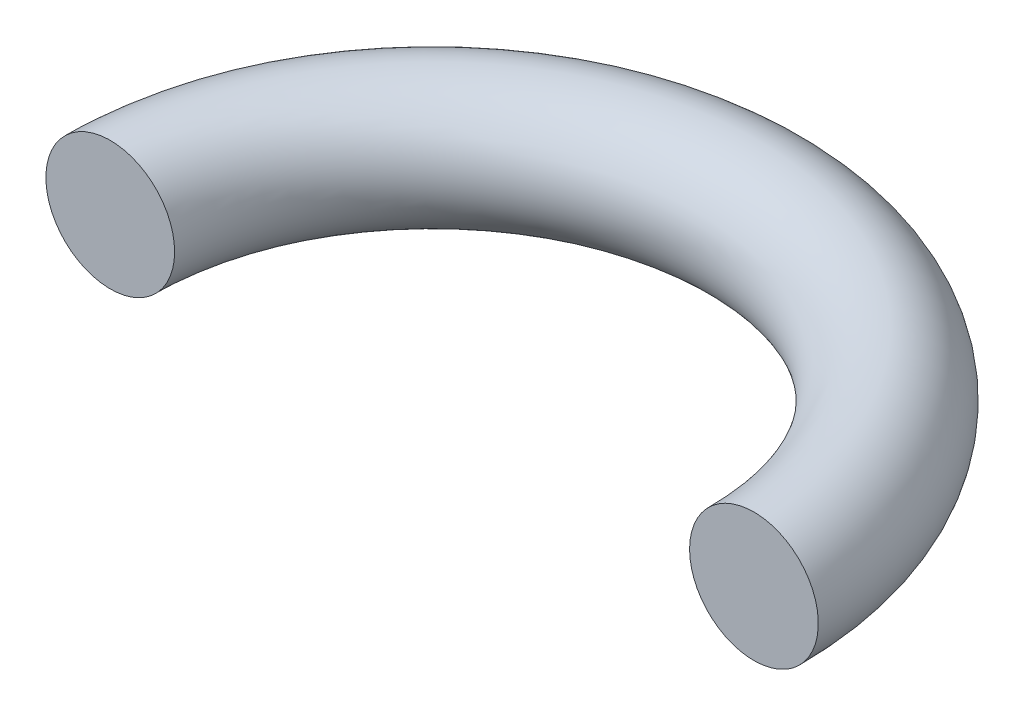
ISO-10303-21;
HEADER;
FILE_DESCRIPTION(('STEP AP214'),'2;1');
FILE_NAME('part.step','',(''),(''),'','','');
FILE_SCHEMA(('AUTOMOTIVE_DESIGN { 1 0 10303 214 1 1 1 1 }'));
ENDSEC;
DATA;
#1=APPLICATION_CONTEXT('core data for automotive mechanical design processes');
#2=APPLICATION_PROTOCOL_DEFINITION('international standard','automotive_design',2000,#1);
#3=PRODUCT_CONTEXT('',#1,'mechanical');
#4=PRODUCT('Part','Part','',(#3));
#5=PRODUCT_RELATED_PRODUCT_CATEGORY('part','',(#4));
#6=PRODUCT_DEFINITION_FORMATION('','',#4);
#7=PRODUCT_DEFINITION_CONTEXT('part definition',#1,'design');
#8=PRODUCT_DEFINITION('design','',#6,#7);
#9=PRODUCT_DEFINITION_SHAPE('','',#8);
#10=(LENGTH_UNIT() NAMED_UNIT(*) SI_UNIT(.MILLI.,.METRE.));
#11=(NAMED_UNIT(*) PLANE_ANGLE_UNIT() SI_UNIT($,.RADIAN.));
#12=(NAMED_UNIT(*) SI_UNIT($,.STERADIAN.) SOLID_ANGLE_UNIT());
#13=UNCERTAINTY_MEASURE_WITH_UNIT(LENGTH_MEASURE(1.E-05),#10,'distance_accuracy_value','');
#14=(GEOMETRIC_REPRESENTATION_CONTEXT(3) GLOBAL_UNCERTAINTY_ASSIGNED_CONTEXT((#13)) GLOBAL_UNIT_ASSIGNED_CONTEXT((#10,
#11,#12)) REPRESENTATION_CONTEXT('',''));
#15=CARTESIAN_POINT('',(0.,0.,0.));
#16=DIRECTION('',(0.,0.,1.));
#17=DIRECTION('',(1.,0.,0.));
#18=AXIS2_PLACEMENT_3D('',#15,#16,#17);
#19=CARTESIAN_POINT('',(5.,0.,0.));
#20=DIRECTION('',(0.,0.,-1.));
#21=DIRECTION('',(-1.,0.,0.));
#22=AXIS2_PLACEMENT_3D('',#19,#20,#21);
#23=PLANE('',#22);
#24=CARTESIAN_POINT('',(5.,0.,0.));
#25=DIRECTION('',(0.,0.,-1.));
#26=DIRECTION('',(-1.,0.,0.));
#27=AXIS2_PLACEMENT_3D('',#24,#25,#26);
#28=CIRCLE('',#27,1.);
#29=CARTESIAN_POINT('',(4.,0.,0.));
#30=VERTEX_POINT('',#29);
#31=EDGE_CURVE('E39',#30,#30,#28,.T.);
#32=ORIENTED_EDGE('',*,*,#31,.F.);
#33=EDGE_LOOP('',(#32));
#34=FACE_BOUND('',#33,.T.);
#35=ADVANCED_FACE('F32',(#34),#23,.F.);
#36=CARTESIAN_POINT('',(-5.,0.,0.));
#37=DIRECTION('',(0.,0.,1.));
#38=DIRECTION('',(1.,0.,0.));
#39=AXIS2_PLACEMENT_3D('',#36,#37,#38);
#40=PLANE('',#39);
#41=CARTESIAN_POINT('',(-5.,0.,0.));
#42=DIRECTION('',(0.,0.,1.));
#43=DIRECTION('',(1.,0.,0.));
#44=AXIS2_PLACEMENT_3D('',#41,#42,#43);
#45=CIRCLE('',#44,1.);
#46=CARTESIAN_POINT('',(-4.,0.,0.));
#47=VERTEX_POINT('',#46);
#48=EDGE_CURVE('E11',#47,#47,#45,.T.);
#49=ORIENTED_EDGE('',*,*,#48,.T.);
#50=EDGE_LOOP('',(#49));
#51=FACE_BOUND('',#50,.T.);
#52=ADVANCED_FACE('F46',(#51),#40,.T.);
#53=CARTESIAN_POINT('',(0.,0.,0.));
#54=DIRECTION('',(0.,1.,0.));
#55=DIRECTION('',(0.,0.,1.));
#56=AXIS2_PLACEMENT_3D('',#53,#54,#55);
#57=TOROIDAL_SURFACE('',#56,5.,1.);
#58=ORIENTED_EDGE('',*,*,#48,.F.);
#59=EDGE_LOOP('',(#58));
#60=FACE_BOUND('',#59,.T.);
#61=ORIENTED_EDGE('',*,*,#31,.T.);
#62=EDGE_LOOP('',(#61));
#63=FACE_BOUND('',#62,.T.);
#64=ADVANCED_FACE('F48',(#60,#63),#57,.T.);
#65=CLOSED_SHELL('',(#35,#52,#64));
#66=MANIFOLD_SOLID_BREP('B2',#65);
#67=ADVANCED_BREP_SHAPE_REPRESENTATION('',(#18,#66),#14);
#68=SHAPE_DEFINITION_REPRESENTATION(#9,#67);
ENDSEC;
END-ISO-10303-21;
